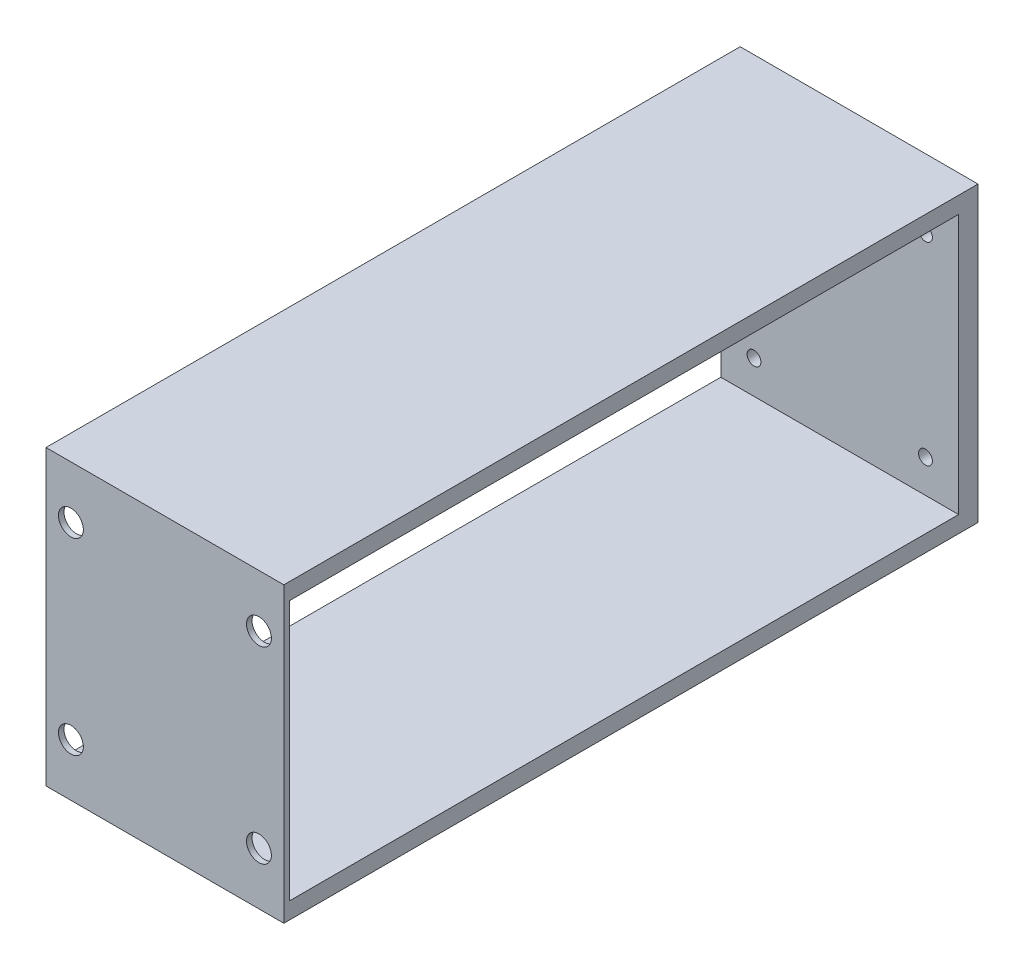
ISO-10303-21;
HEADER;
FILE_DESCRIPTION(('STEP AP214'),'2;1');
FILE_NAME('part.step','',(''),(''),'','','');
FILE_SCHEMA(('AUTOMOTIVE_DESIGN { 1 0 10303 214 1 1 1 1 }'));
ENDSEC;
DATA;
#1=APPLICATION_CONTEXT('core data for automotive mechanical design processes');
#2=APPLICATION_PROTOCOL_DEFINITION('international standard','automotive_design',2000,#1);
#3=PRODUCT_CONTEXT('',#1,'mechanical');
#4=PRODUCT('Part','Part','',(#3));
#5=PRODUCT_RELATED_PRODUCT_CATEGORY('part','',(#4));
#6=PRODUCT_DEFINITION_FORMATION('','',#4);
#7=PRODUCT_DEFINITION_CONTEXT('part definition',#1,'design');
#8=PRODUCT_DEFINITION('design','',#6,#7);
#9=PRODUCT_DEFINITION_SHAPE('','',#8);
#10=(LENGTH_UNIT() NAMED_UNIT(*) SI_UNIT(.MILLI.,.METRE.));
#11=(NAMED_UNIT(*) PLANE_ANGLE_UNIT() SI_UNIT($,.RADIAN.));
#12=(NAMED_UNIT(*) SI_UNIT($,.STERADIAN.) SOLID_ANGLE_UNIT());
#13=UNCERTAINTY_MEASURE_WITH_UNIT(LENGTH_MEASURE(1.E-05),#10,'distance_accuracy_value','');
#14=(GEOMETRIC_REPRESENTATION_CONTEXT(3) GLOBAL_UNCERTAINTY_ASSIGNED_CONTEXT((#13)) GLOBAL_UNIT_ASSIGNED_CONTEXT((#10,
#11,#12)) REPRESENTATION_CONTEXT('',''));
#15=CARTESIAN_POINT('',(0.,0.,0.));
#16=DIRECTION('',(0.,0.,1.));
#17=DIRECTION('',(1.,0.,0.));
#18=AXIS2_PLACEMENT_3D('',#15,#16,#17);
#19=CARTESIAN_POINT('',(17.,17.,-9.));
#20=DIRECTION('',(0.,0.,1.));
#21=DIRECTION('',(1.,0.,0.));
#22=AXIS2_PLACEMENT_3D('',#19,#20,#21);
#23=CYLINDRICAL_SURFACE('',#22,2.25);
#24=CARTESIAN_POINT('',(17.,17.,0.));
#25=DIRECTION('',(0.,0.,-1.));
#26=DIRECTION('',(-1.,0.,0.));
#27=AXIS2_PLACEMENT_3D('',#24,#25,#26);
#28=CIRCLE('',#27,2.25);
#29=CARTESIAN_POINT('',(14.75,17.,0.));
#30=VERTEX_POINT('',#29);
#31=EDGE_CURVE('E49',#30,#30,#28,.T.);
#32=ORIENTED_EDGE('',*,*,#31,.T.);
#33=EDGE_LOOP('',(#32));
#34=FACE_BOUND('',#33,.T.);
#35=CARTESIAN_POINT('',(17.,17.,1.));
#36=DIRECTION('',(0.,0.,1.));
#37=DIRECTION('',(1.,0.,0.));
#38=AXIS2_PLACEMENT_3D('',#35,#36,#37);
#39=CIRCLE('',#38,2.25);
#40=CARTESIAN_POINT('',(19.25,17.,1.));
#41=VERTEX_POINT('',#40);
#42=EDGE_CURVE('E11',#41,#41,#39,.T.);
#43=ORIENTED_EDGE('',*,*,#42,.T.);
#44=EDGE_LOOP('',(#43));
#45=FACE_BOUND('',#44,.T.);
#46=ADVANCED_FACE('F41',(#34,#45),#23,.F.);
#47=CARTESIAN_POINT('',(17.,-17.,-9.));
#48=DIRECTION('',(0.,0.,1.));
#49=DIRECTION('',(1.,0.,0.));
#50=AXIS2_PLACEMENT_3D('',#47,#48,#49);
#51=CYLINDRICAL_SURFACE('',#50,2.25);
#52=CARTESIAN_POINT('',(17.,-17.,0.));
#53=DIRECTION('',(0.,0.,-1.));
#54=DIRECTION('',(-1.,0.,0.));
#55=AXIS2_PLACEMENT_3D('',#52,#53,#54);
#56=CIRCLE('',#55,2.25);
#57=CARTESIAN_POINT('',(14.75,-17.,0.));
#58=VERTEX_POINT('',#57);
#59=EDGE_CURVE('E208',#58,#58,#56,.T.);
#60=ORIENTED_EDGE('',*,*,#59,.T.);
#61=EDGE_LOOP('',(#60));
#62=FACE_BOUND('',#61,.T.);
#63=CARTESIAN_POINT('',(17.,-17.,1.));
#64=DIRECTION('',(0.,0.,1.));
#65=DIRECTION('',(1.,0.,0.));
#66=AXIS2_PLACEMENT_3D('',#63,#64,#65);
#67=CIRCLE('',#66,2.25);
#68=CARTESIAN_POINT('',(19.25,-17.,1.));
#69=VERTEX_POINT('',#68);
#70=EDGE_CURVE('E224',#69,#69,#67,.T.);
#71=ORIENTED_EDGE('',*,*,#70,.T.);
#72=EDGE_LOOP('',(#71));
#73=FACE_BOUND('',#72,.T.);
#74=ADVANCED_FACE('F253',(#62,#73),#51,.F.);
#75=CARTESIAN_POINT('',(21.5,-23.5,1.));
#76=DIRECTION('',(-1.,0.,0.));
#77=DIRECTION('',(0.,0.,1.));
#78=AXIS2_PLACEMENT_3D('',#75,#76,#77);
#79=PLANE('',#78);
#80=DIRECTION('',(0.,0.,-1.));
#81=VECTOR('',#80,1.);
#82=CARTESIAN_POINT('',(21.5,23.5,1.));
#83=LINE('',#82,#81);
#84=CARTESIAN_POINT('',(21.5,23.5,0.));
#85=VERTEX_POINT('',#84);
#86=CARTESIAN_POINT('',(21.5,23.5,-121.));
#87=VERTEX_POINT('',#86);
#88=EDGE_CURVE('E196',#85,#87,#83,.T.);
#89=ORIENTED_EDGE('',*,*,#88,.T.);
#90=DIRECTION('',(0.,-1.,0.));
#91=VECTOR('',#90,1.);
#92=CARTESIAN_POINT('',(21.5,26.5,-121.));
#93=LINE('',#92,#91);
#94=CARTESIAN_POINT('',(21.5,-23.5,-121.));
#95=VERTEX_POINT('',#94);
#96=EDGE_CURVE('E140',#87,#95,#93,.T.);
#97=ORIENTED_EDGE('',*,*,#96,.T.);
#98=DIRECTION('',(0.,0.,1.));
#99=VECTOR('',#98,1.);
#100=CARTESIAN_POINT('',(21.5,-23.5,1.));
#101=LINE('',#100,#99);
#102=CARTESIAN_POINT('',(21.5,-23.5,0.));
#103=VERTEX_POINT('',#102);
#104=EDGE_CURVE('E171',#95,#103,#101,.T.);
#105=ORIENTED_EDGE('',*,*,#104,.T.);
#106=DIRECTION('',(0.,1.,0.));
#107=VECTOR('',#106,1.);
#108=CARTESIAN_POINT('',(21.5,-23.5,0.));
#109=LINE('',#108,#107);
#110=EDGE_CURVE('E193',#103,#85,#109,.T.);
#111=ORIENTED_EDGE('',*,*,#110,.T.);
#112=EDGE_LOOP('',(#89,#97,#105,#111));
#113=FACE_BOUND('',#112,.T.);
#114=DIRECTION('',(0.,-1.,0.));
#115=VECTOR('',#114,1.);
#116=CARTESIAN_POINT('',(21.5,26.5,-124.5));
#117=LINE('',#116,#115);
#118=CARTESIAN_POINT('',(21.5,26.5,-124.5));
#119=VERTEX_POINT('',#118);
#120=CARTESIAN_POINT('',(21.5,-26.5,-124.5));
#121=VERTEX_POINT('',#120);
#122=EDGE_CURVE('E111',#119,#121,#117,.T.);
#123=ORIENTED_EDGE('',*,*,#122,.F.);
#124=DIRECTION('',(0.,0.,-1.));
#125=VECTOR('',#124,1.);
#126=CARTESIAN_POINT('',(21.5,26.5,1.));
#127=LINE('',#126,#125);
#128=CARTESIAN_POINT('',(21.5,26.5,1.));
#129=VERTEX_POINT('',#128);
#130=EDGE_CURVE('E190',#129,#119,#127,.T.);
#131=ORIENTED_EDGE('',*,*,#130,.F.);
#132=DIRECTION('',(0.,1.,0.));
#133=VECTOR('',#132,1.);
#134=CARTESIAN_POINT('',(21.5,-23.5,1.));
#135=LINE('',#134,#133);
#136=CARTESIAN_POINT('',(21.5,-26.5,1.));
#137=VERTEX_POINT('',#136);
#138=EDGE_CURVE('E112',#137,#129,#135,.T.);
#139=ORIENTED_EDGE('',*,*,#138,.F.);
#140=DIRECTION('',(0.,0.,1.));
#141=VECTOR('',#140,1.);
#142=CARTESIAN_POINT('',(21.5,-26.5,1.));
#143=LINE('',#142,#141);
#144=EDGE_CURVE('E106',#121,#137,#143,.T.);
#145=ORIENTED_EDGE('',*,*,#144,.F.);
#146=EDGE_LOOP('',(#123,#131,#139,#145));
#147=FACE_BOUND('',#146,.T.);
#148=ADVANCED_FACE('F108',(#113,#147),#79,.F.);
#149=CARTESIAN_POINT('',(-21.5,-23.5,1.));
#150=DIRECTION('',(1.,0.,0.));
#151=DIRECTION('',(0.,0.,-1.));
#152=AXIS2_PLACEMENT_3D('',#149,#150,#151);
#153=PLANE('',#152);
#154=DIRECTION('',(0.,1.,0.));
#155=VECTOR('',#154,1.);
#156=CARTESIAN_POINT('',(-21.5,26.5,-121.));
#157=LINE('',#156,#155);
#158=CARTESIAN_POINT('',(-21.5,-23.5,-121.));
#159=VERTEX_POINT('',#158);
#160=CARTESIAN_POINT('',(-21.5,23.5,-121.));
#161=VERTEX_POINT('',#160);
#162=EDGE_CURVE('E136',#159,#161,#157,.T.);
#163=ORIENTED_EDGE('',*,*,#162,.T.);
#164=DIRECTION('',(0.,0.,1.));
#165=VECTOR('',#164,1.);
#166=CARTESIAN_POINT('',(-21.5,23.5,1.));
#167=LINE('',#166,#165);
#168=CARTESIAN_POINT('',(-21.5,23.5,0.));
#169=VERTEX_POINT('',#168);
#170=EDGE_CURVE('E170',#161,#169,#167,.T.);
#171=ORIENTED_EDGE('',*,*,#170,.T.);
#172=DIRECTION('',(0.,-1.,0.));
#173=VECTOR('',#172,1.);
#174=CARTESIAN_POINT('',(-21.5,-23.5,0.));
#175=LINE('',#174,#173);
#176=CARTESIAN_POINT('',(-21.5,-23.5,0.));
#177=VERTEX_POINT('',#176);
#178=EDGE_CURVE('E56',#169,#177,#175,.T.);
#179=ORIENTED_EDGE('',*,*,#178,.T.);
#180=DIRECTION('',(0.,0.,-1.));
#181=VECTOR('',#180,1.);
#182=CARTESIAN_POINT('',(-21.5,-23.5,0.999999999999995));
#183=LINE('',#182,#181);
#184=EDGE_CURVE('E175',#177,#159,#183,.T.);
#185=ORIENTED_EDGE('',*,*,#184,.T.);
#186=EDGE_LOOP('',(#163,#171,#179,#185));
#187=FACE_BOUND('',#186,.T.);
#188=DIRECTION('',(0.,0.,1.));
#189=VECTOR('',#188,1.);
#190=CARTESIAN_POINT('',(-21.5,26.5,1.));
#191=LINE('',#190,#189);
#192=CARTESIAN_POINT('',(-21.5,26.5,-124.5));
#193=VERTEX_POINT('',#192);
#194=CARTESIAN_POINT('',(-21.5,26.5,1.));
#195=VERTEX_POINT('',#194);
#196=EDGE_CURVE('E181',#193,#195,#191,.T.);
#197=ORIENTED_EDGE('',*,*,#196,.F.);
#198=DIRECTION('',(0.,1.,0.));
#199=VECTOR('',#198,1.);
#200=CARTESIAN_POINT('',(-21.5,26.5,-124.5));
#201=LINE('',#200,#199);
#202=CARTESIAN_POINT('',(-21.5,-26.5,-124.5));
#203=VERTEX_POINT('',#202);
#204=EDGE_CURVE('E129',#203,#193,#201,.T.);
#205=ORIENTED_EDGE('',*,*,#204,.F.);
#206=DIRECTION('',(0.,0.,-1.));
#207=VECTOR('',#206,1.);
#208=CARTESIAN_POINT('',(-21.5,-26.5,0.999999999999995));
#209=LINE('',#208,#207);
#210=CARTESIAN_POINT('',(-21.5,-26.5,0.999999999999995));
#211=VERTEX_POINT('',#210);
#212=EDGE_CURVE('E124',#211,#203,#209,.T.);
#213=ORIENTED_EDGE('',*,*,#212,.F.);
#214=DIRECTION('',(0.,-1.,0.));
#215=VECTOR('',#214,1.);
#216=CARTESIAN_POINT('',(-21.5,-23.5,1.));
#217=LINE('',#216,#215);
#218=EDGE_CURVE('E204',#195,#211,#217,.T.);
#219=ORIENTED_EDGE('',*,*,#218,.F.);
#220=EDGE_LOOP('',(#197,#205,#213,#219));
#221=FACE_BOUND('',#220,.T.);
#222=ADVANCED_FACE('F246',(#187,#221),#153,.F.);
#223=CARTESIAN_POINT('',(0.,0.,1.));
#224=DIRECTION('',(0.,0.,-1.));
#225=DIRECTION('',(-1.,0.,0.));
#226=AXIS2_PLACEMENT_3D('',#223,#224,#225);
#227=PLANE('',#226);
#228=CARTESIAN_POINT('',(-17.,17.,1.));
#229=DIRECTION('',(0.,0.,1.));
#230=DIRECTION('',(1.,0.,0.));
#231=AXIS2_PLACEMENT_3D('',#228,#229,#230);
#232=CIRCLE('',#231,2.25);
#233=CARTESIAN_POINT('',(-14.75,17.,1.));
#234=VERTEX_POINT('',#233);
#235=EDGE_CURVE('E157',#234,#234,#232,.T.);
#236=ORIENTED_EDGE('',*,*,#235,.F.);
#237=EDGE_LOOP('',(#236));
#238=FACE_BOUND('',#237,.T.);
#239=CARTESIAN_POINT('',(-17.,-17.,1.));
#240=DIRECTION('',(0.,0.,1.));
#241=DIRECTION('',(1.,0.,0.));
#242=AXIS2_PLACEMENT_3D('',#239,#240,#241);
#243=CIRCLE('',#242,2.25);
#244=CARTESIAN_POINT('',(-14.75,-17.,1.));
#245=VERTEX_POINT('',#244);
#246=EDGE_CURVE('E161',#245,#245,#243,.T.);
#247=ORIENTED_EDGE('',*,*,#246,.F.);
#248=EDGE_LOOP('',(#247));
#249=FACE_BOUND('',#248,.T.);
#250=ORIENTED_EDGE('',*,*,#138,.T.);
#251=DIRECTION('',(1.,0.,0.));
#252=VECTOR('',#251,1.);
#253=CARTESIAN_POINT('',(-21.5,26.5,1.));
#254=LINE('',#253,#252);
#255=EDGE_CURVE('E185',#195,#129,#254,.T.);
#256=ORIENTED_EDGE('',*,*,#255,.F.);
#257=ORIENTED_EDGE('',*,*,#218,.T.);
#258=DIRECTION('',(-1.,0.,0.));
#259=VECTOR('',#258,1.);
#260=CARTESIAN_POINT('',(21.5,-26.5,1.));
#261=LINE('',#260,#259);
#262=EDGE_CURVE('E117',#137,#211,#261,.T.);
#263=ORIENTED_EDGE('',*,*,#262,.F.);
#264=EDGE_LOOP('',(#250,#256,#257,#263));
#265=FACE_BOUND('',#264,.T.);
#266=ORIENTED_EDGE('',*,*,#70,.F.);
#267=EDGE_LOOP('',(#266));
#268=FACE_BOUND('',#267,.T.);
#269=ORIENTED_EDGE('',*,*,#42,.F.);
#270=EDGE_LOOP('',(#269));
#271=FACE_BOUND('',#270,.T.);
#272=ADVANCED_FACE('F236',(#238,#249,#265,#268,#271),#227,.F.);
#273=CARTESIAN_POINT('',(0.,0.,0.));
#274=DIRECTION('',(0.,0.,-1.));
#275=DIRECTION('',(-1.,0.,0.));
#276=AXIS2_PLACEMENT_3D('',#273,#274,#275);
#277=PLANE('',#276);
#278=CARTESIAN_POINT('',(-17.,17.,0.));
#279=DIRECTION('',(0.,0.,-1.));
#280=DIRECTION('',(-1.,0.,0.));
#281=AXIS2_PLACEMENT_3D('',#278,#279,#280);
#282=CIRCLE('',#281,2.25);
#283=CARTESIAN_POINT('',(-19.25,17.,0.));
#284=VERTEX_POINT('',#283);
#285=EDGE_CURVE('E150',#284,#284,#282,.T.);
#286=ORIENTED_EDGE('',*,*,#285,.F.);
#287=EDGE_LOOP('',(#286));
#288=FACE_BOUND('',#287,.T.);
#289=CARTESIAN_POINT('',(-17.,-17.,0.));
#290=DIRECTION('',(0.,0.,-1.));
#291=DIRECTION('',(-1.,0.,0.));
#292=AXIS2_PLACEMENT_3D('',#289,#290,#291);
#293=CIRCLE('',#292,2.25);
#294=CARTESIAN_POINT('',(-19.25,-17.,0.));
#295=VERTEX_POINT('',#294);
#296=EDGE_CURVE('E164',#295,#295,#293,.T.);
#297=ORIENTED_EDGE('',*,*,#296,.F.);
#298=EDGE_LOOP('',(#297));
#299=FACE_BOUND('',#298,.T.);
#300=ORIENTED_EDGE('',*,*,#110,.F.);
#301=DIRECTION('',(1.,0.,0.));
#302=VECTOR('',#301,1.);
#303=CARTESIAN_POINT('',(-21.5,-23.5,0.));
#304=LINE('',#303,#302);
#305=EDGE_CURVE('E205',#177,#103,#304,.T.);
#306=ORIENTED_EDGE('',*,*,#305,.F.);
#307=ORIENTED_EDGE('',*,*,#178,.F.);
#308=DIRECTION('',(-1.,0.,0.));
#309=VECTOR('',#308,1.);
#310=CARTESIAN_POINT('',(-21.5,23.5,0.));
#311=LINE('',#310,#309);
#312=EDGE_CURVE('E63',#85,#169,#311,.T.);
#313=ORIENTED_EDGE('',*,*,#312,.F.);
#314=EDGE_LOOP('',(#300,#306,#307,#313));
#315=FACE_BOUND('',#314,.T.);
#316=ORIENTED_EDGE('',*,*,#59,.F.);
#317=EDGE_LOOP('',(#316));
#318=FACE_BOUND('',#317,.T.);
#319=ORIENTED_EDGE('',*,*,#31,.F.);
#320=EDGE_LOOP('',(#319));
#321=FACE_BOUND('',#320,.T.);
#322=ADVANCED_FACE('F233',(#288,#299,#315,#318,#321),#277,.T.);
#323=CARTESIAN_POINT('',(0.,26.5,0.));
#324=DIRECTION('',(0.,-1.,0.));
#325=DIRECTION('',(0.,0.,-1.));
#326=AXIS2_PLACEMENT_3D('',#323,#324,#325);
#327=PLANE('',#326);
#328=ORIENTED_EDGE('',*,*,#196,.T.);
#329=ORIENTED_EDGE('',*,*,#255,.T.);
#330=ORIENTED_EDGE('',*,*,#130,.T.);
#331=DIRECTION('',(1.,0.,0.));
#332=VECTOR('',#331,1.);
#333=CARTESIAN_POINT('',(21.5,26.5,-124.5));
#334=LINE('',#333,#332);
#335=EDGE_CURVE('E134',#193,#119,#334,.T.);
#336=ORIENTED_EDGE('',*,*,#335,.F.);
#337=EDGE_LOOP('',(#328,#329,#330,#336));
#338=FACE_BOUND('',#337,.T.);
#339=ADVANCED_FACE('F235',(#338),#327,.F.);
#340=CARTESIAN_POINT('',(0.,23.5,0.));
#341=DIRECTION('',(0.,-1.,0.));
#342=DIRECTION('',(0.,0.,-1.));
#343=AXIS2_PLACEMENT_3D('',#340,#341,#342);
#344=PLANE('',#343);
#345=ORIENTED_EDGE('',*,*,#88,.F.);
#346=ORIENTED_EDGE('',*,*,#312,.T.);
#347=ORIENTED_EDGE('',*,*,#170,.F.);
#348=DIRECTION('',(-1.,0.,0.));
#349=VECTOR('',#348,1.);
#350=CARTESIAN_POINT('',(-21.5,23.5,-121.));
#351=LINE('',#350,#349);
#352=EDGE_CURVE('E186',#87,#161,#351,.T.);
#353=ORIENTED_EDGE('',*,*,#352,.F.);
#354=EDGE_LOOP('',(#345,#346,#347,#353));
#355=FACE_BOUND('',#354,.T.);
#356=ADVANCED_FACE('F243',(#355),#344,.T.);
#357=CARTESIAN_POINT('',(0.,-26.5,0.));
#358=DIRECTION('',(0.,1.,0.));
#359=DIRECTION('',(0.,0.,1.));
#360=AXIS2_PLACEMENT_3D('',#357,#358,#359);
#361=PLANE('',#360);
#362=ORIENTED_EDGE('',*,*,#144,.T.);
#363=ORIENTED_EDGE('',*,*,#262,.T.);
#364=ORIENTED_EDGE('',*,*,#212,.T.);
#365=DIRECTION('',(-1.,0.,0.));
#366=VECTOR('',#365,1.);
#367=CARTESIAN_POINT('',(21.5,-26.5,-124.5));
#368=LINE('',#367,#366);
#369=EDGE_CURVE('E121',#121,#203,#368,.T.);
#370=ORIENTED_EDGE('',*,*,#369,.F.);
#371=EDGE_LOOP('',(#362,#363,#364,#370));
#372=FACE_BOUND('',#371,.T.);
#373=ADVANCED_FACE('F122',(#372),#361,.F.);
#374=CARTESIAN_POINT('',(0.,-23.5,0.));
#375=DIRECTION('',(0.,1.,0.));
#376=DIRECTION('',(0.,0.,1.));
#377=AXIS2_PLACEMENT_3D('',#374,#375,#376);
#378=PLANE('',#377);
#379=ORIENTED_EDGE('',*,*,#184,.F.);
#380=ORIENTED_EDGE('',*,*,#305,.T.);
#381=ORIENTED_EDGE('',*,*,#104,.F.);
#382=DIRECTION('',(1.,0.,0.));
#383=VECTOR('',#382,1.);
#384=CARTESIAN_POINT('',(21.5,-23.5,-121.));
#385=LINE('',#384,#383);
#386=EDGE_CURVE('E118',#159,#95,#385,.T.);
#387=ORIENTED_EDGE('',*,*,#386,.F.);
#388=EDGE_LOOP('',(#379,#380,#381,#387));
#389=FACE_BOUND('',#388,.T.);
#390=ADVANCED_FACE('F285',(#389),#378,.T.);
#391=CARTESIAN_POINT('',(-17.,-17.,-9.));
#392=DIRECTION('',(0.,0.,1.));
#393=DIRECTION('',(1.,0.,0.));
#394=AXIS2_PLACEMENT_3D('',#391,#392,#393);
#395=CYLINDRICAL_SURFACE('',#394,2.25);
#396=ORIENTED_EDGE('',*,*,#296,.T.);
#397=EDGE_LOOP('',(#396));
#398=FACE_BOUND('',#397,.T.);
#399=ORIENTED_EDGE('',*,*,#246,.T.);
#400=EDGE_LOOP('',(#399));
#401=FACE_BOUND('',#400,.T.);
#402=ADVANCED_FACE('F287',(#398,#401),#395,.F.);
#403=CARTESIAN_POINT('',(-17.,17.,-9.));
#404=DIRECTION('',(0.,0.,1.));
#405=DIRECTION('',(1.,0.,0.));
#406=AXIS2_PLACEMENT_3D('',#403,#404,#405);
#407=CYLINDRICAL_SURFACE('',#406,2.25);
#408=ORIENTED_EDGE('',*,*,#285,.T.);
#409=EDGE_LOOP('',(#408));
#410=FACE_BOUND('',#409,.T.);
#411=ORIENTED_EDGE('',*,*,#235,.T.);
#412=EDGE_LOOP('',(#411));
#413=FACE_BOUND('',#412,.T.);
#414=ADVANCED_FACE('F293',(#410,#413),#407,.F.);
#415=CARTESIAN_POINT('',(0.,0.,-124.5));
#416=DIRECTION('',(0.,0.,-1.));
#417=DIRECTION('',(-1.,0.,0.));
#418=AXIS2_PLACEMENT_3D('',#415,#416,#417);
#419=PLANE('',#418);
#420=CARTESIAN_POINT('',(-15.5,17.5,-124.5));
#421=DIRECTION('',(0.,0.,-1.));
#422=DIRECTION('',(-1.,0.,0.));
#423=AXIS2_PLACEMENT_3D('',#420,#421,#422);
#424=CIRCLE('',#423,1.25);
#425=CARTESIAN_POINT('',(-16.75,17.5,-124.5));
#426=VERTEX_POINT('',#425);
#427=EDGE_CURVE('E468',#426,#426,#424,.T.);
#428=ORIENTED_EDGE('',*,*,#427,.F.);
#429=EDGE_LOOP('',(#428));
#430=FACE_BOUND('',#429,.T.);
#431=CARTESIAN_POINT('',(15.5,17.5,-124.5));
#432=DIRECTION('',(0.,0.,-1.));
#433=DIRECTION('',(-1.,0.,0.));
#434=AXIS2_PLACEMENT_3D('',#431,#432,#433);
#435=CIRCLE('',#434,1.25);
#436=CARTESIAN_POINT('',(14.25,17.5,-124.5));
#437=VERTEX_POINT('',#436);
#438=EDGE_CURVE('E481',#437,#437,#435,.T.);
#439=ORIENTED_EDGE('',*,*,#438,.F.);
#440=EDGE_LOOP('',(#439));
#441=FACE_BOUND('',#440,.T.);
#442=CARTESIAN_POINT('',(-15.5,-17.5,-124.5));
#443=DIRECTION('',(0.,0.,-1.));
#444=DIRECTION('',(-1.,0.,0.));
#445=AXIS2_PLACEMENT_3D('',#442,#443,#444);
#446=CIRCLE('',#445,1.25);
#447=CARTESIAN_POINT('',(-16.75,-17.5,-124.5));
#448=VERTEX_POINT('',#447);
#449=EDGE_CURVE('E489',#448,#448,#446,.T.);
#450=ORIENTED_EDGE('',*,*,#449,.F.);
#451=EDGE_LOOP('',(#450));
#452=FACE_BOUND('',#451,.T.);
#453=CARTESIAN_POINT('',(15.5,-17.5,-124.5));
#454=DIRECTION('',(0.,0.,-1.));
#455=DIRECTION('',(-1.,0.,0.));
#456=AXIS2_PLACEMENT_3D('',#453,#454,#455);
#457=CIRCLE('',#456,1.25);
#458=CARTESIAN_POINT('',(14.25,-17.5,-124.5));
#459=VERTEX_POINT('',#458);
#460=EDGE_CURVE('E143',#459,#459,#457,.T.);
#461=ORIENTED_EDGE('',*,*,#460,.F.);
#462=EDGE_LOOP('',(#461));
#463=FACE_BOUND('',#462,.T.);
#464=ORIENTED_EDGE('',*,*,#122,.T.);
#465=ORIENTED_EDGE('',*,*,#369,.T.);
#466=ORIENTED_EDGE('',*,*,#204,.T.);
#467=ORIENTED_EDGE('',*,*,#335,.T.);
#468=EDGE_LOOP('',(#464,#465,#466,#467));
#469=FACE_BOUND('',#468,.T.);
#470=ADVANCED_FACE('F132',(#430,#441,#452,#463,#469),#419,.T.);
#471=CARTESIAN_POINT('',(0.,0.,-121.));
#472=DIRECTION('',(0.,0.,-1.));
#473=DIRECTION('',(-1.,0.,0.));
#474=AXIS2_PLACEMENT_3D('',#471,#472,#473);
#475=PLANE('',#474);
#476=CARTESIAN_POINT('',(-15.5,17.5,-121.));
#477=DIRECTION('',(0.,0.,1.));
#478=DIRECTION('',(1.,0.,0.));
#479=AXIS2_PLACEMENT_3D('',#476,#477,#478);
#480=CIRCLE('',#479,1.25);
#481=CARTESIAN_POINT('',(-14.25,17.5,-121.));
#482=VERTEX_POINT('',#481);
#483=EDGE_CURVE('E471',#482,#482,#480,.T.);
#484=ORIENTED_EDGE('',*,*,#483,.F.);
#485=EDGE_LOOP('',(#484));
#486=FACE_BOUND('',#485,.T.);
#487=CARTESIAN_POINT('',(15.5,17.5,-121.));
#488=DIRECTION('',(0.,0.,1.));
#489=DIRECTION('',(1.,0.,0.));
#490=AXIS2_PLACEMENT_3D('',#487,#488,#489);
#491=CIRCLE('',#490,1.25);
#492=CARTESIAN_POINT('',(16.75,17.5,-121.));
#493=VERTEX_POINT('',#492);
#494=EDGE_CURVE('E475',#493,#493,#491,.T.);
#495=ORIENTED_EDGE('',*,*,#494,.F.);
#496=EDGE_LOOP('',(#495));
#497=FACE_BOUND('',#496,.T.);
#498=CARTESIAN_POINT('',(-15.5,-17.5,-121.));
#499=DIRECTION('',(0.,0.,1.));
#500=DIRECTION('',(1.,0.,0.));
#501=AXIS2_PLACEMENT_3D('',#498,#499,#500);
#502=CIRCLE('',#501,1.25);
#503=CARTESIAN_POINT('',(-14.25,-17.5,-121.));
#504=VERTEX_POINT('',#503);
#505=EDGE_CURVE('E485',#504,#504,#502,.T.);
#506=ORIENTED_EDGE('',*,*,#505,.F.);
#507=EDGE_LOOP('',(#506));
#508=FACE_BOUND('',#507,.T.);
#509=CARTESIAN_POINT('',(15.5,-17.5,-121.));
#510=DIRECTION('',(0.,0.,1.));
#511=DIRECTION('',(1.,0.,0.));
#512=AXIS2_PLACEMENT_3D('',#509,#510,#511);
#513=CIRCLE('',#512,1.25);
#514=CARTESIAN_POINT('',(16.75,-17.5,-121.));
#515=VERTEX_POINT('',#514);
#516=EDGE_CURVE('E492',#515,#515,#513,.T.);
#517=ORIENTED_EDGE('',*,*,#516,.F.);
#518=EDGE_LOOP('',(#517));
#519=FACE_BOUND('',#518,.T.);
#520=ORIENTED_EDGE('',*,*,#352,.T.);
#521=ORIENTED_EDGE('',*,*,#162,.F.);
#522=ORIENTED_EDGE('',*,*,#386,.T.);
#523=ORIENTED_EDGE('',*,*,#96,.F.);
#524=EDGE_LOOP('',(#520,#521,#522,#523));
#525=FACE_BOUND('',#524,.T.);
#526=ADVANCED_FACE('F278',(#486,#497,#508,#519,#525),#475,.F.);
#527=CARTESIAN_POINT('',(15.5,-17.5,-121.));
#528=DIRECTION('',(0.,0.,1.));
#529=DIRECTION('',(1.,0.,0.));
#530=AXIS2_PLACEMENT_3D('',#527,#528,#529);
#531=CYLINDRICAL_SURFACE('',#530,1.25);
#532=ORIENTED_EDGE('',*,*,#460,.T.);
#533=EDGE_LOOP('',(#532));
#534=FACE_BOUND('',#533,.T.);
#535=ORIENTED_EDGE('',*,*,#516,.T.);
#536=EDGE_LOOP('',(#535));
#537=FACE_BOUND('',#536,.T.);
#538=ADVANCED_FACE('F333',(#534,#537),#531,.F.);
#539=CARTESIAN_POINT('',(-15.5,-17.5,-121.));
#540=DIRECTION('',(0.,0.,1.));
#541=DIRECTION('',(1.,0.,0.));
#542=AXIS2_PLACEMENT_3D('',#539,#540,#541);
#543=CYLINDRICAL_SURFACE('',#542,1.25);
#544=ORIENTED_EDGE('',*,*,#449,.T.);
#545=EDGE_LOOP('',(#544));
#546=FACE_BOUND('',#545,.T.);
#547=ORIENTED_EDGE('',*,*,#505,.T.);
#548=EDGE_LOOP('',(#547));
#549=FACE_BOUND('',#548,.T.);
#550=ADVANCED_FACE('F344',(#546,#549),#543,.F.);
#551=CARTESIAN_POINT('',(15.5,17.5,-121.));
#552=DIRECTION('',(0.,0.,1.));
#553=DIRECTION('',(1.,0.,0.));
#554=AXIS2_PLACEMENT_3D('',#551,#552,#553);
#555=CYLINDRICAL_SURFACE('',#554,1.25);
#556=ORIENTED_EDGE('',*,*,#438,.T.);
#557=EDGE_LOOP('',(#556));
#558=FACE_BOUND('',#557,.T.);
#559=ORIENTED_EDGE('',*,*,#494,.T.);
#560=EDGE_LOOP('',(#559));
#561=FACE_BOUND('',#560,.T.);
#562=ADVANCED_FACE('F355',(#558,#561),#555,.F.);
#563=CARTESIAN_POINT('',(-15.5,17.5,-121.));
#564=DIRECTION('',(0.,0.,1.));
#565=DIRECTION('',(1.,0.,0.));
#566=AXIS2_PLACEMENT_3D('',#563,#564,#565);
#567=CYLINDRICAL_SURFACE('',#566,1.25);
#568=ORIENTED_EDGE('',*,*,#427,.T.);
#569=EDGE_LOOP('',(#568));
#570=FACE_BOUND('',#569,.T.);
#571=ORIENTED_EDGE('',*,*,#483,.T.);
#572=EDGE_LOOP('',(#571));
#573=FACE_BOUND('',#572,.T.);
#574=ADVANCED_FACE('F366',(#570,#573),#567,.F.);
#575=CLOSED_SHELL('',(#46,#74,#148,#222,#272,#322,#339,#356,#373,#390,#402,#414,#470,#526,#538,
#550,#562,#574));
#576=MANIFOLD_SOLID_BREP('B2',#575);
#577=ADVANCED_BREP_SHAPE_REPRESENTATION('',(#18,#576),#14);
#578=SHAPE_DEFINITION_REPRESENTATION(#9,#577);
ENDSEC;
END-ISO-10303-21;
